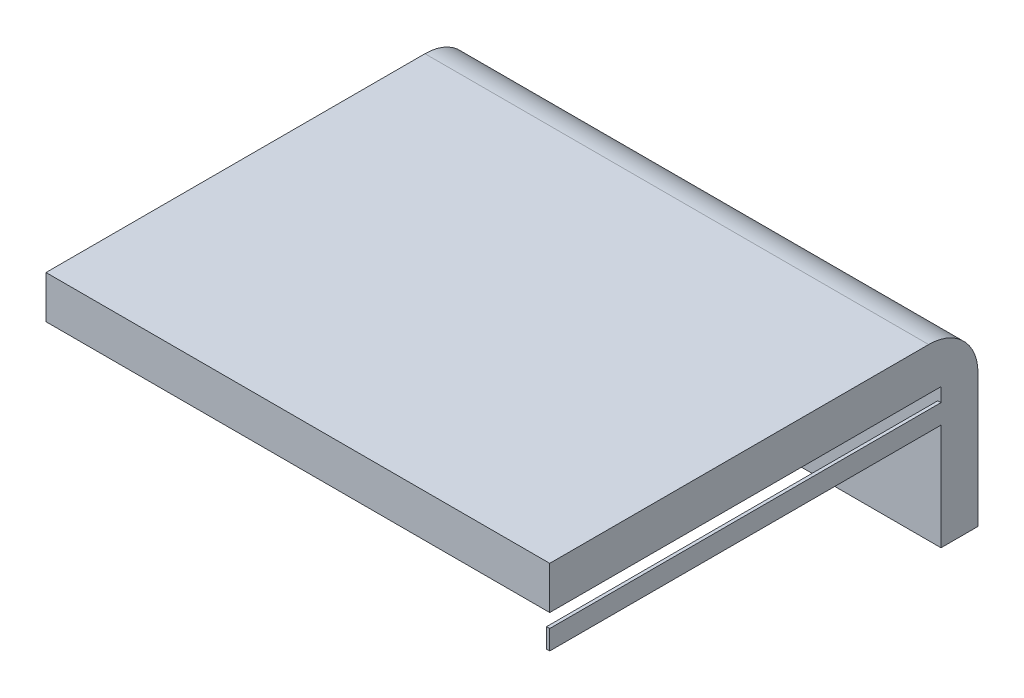
ISO-10303-21;
HEADER;
FILE_DESCRIPTION(('STEP AP214'),'2;1');
FILE_NAME('part.step','',(''),(''),'','','');
FILE_SCHEMA(('AUTOMOTIVE_DESIGN { 1 0 10303 214 1 1 1 1 }'));
ENDSEC;
DATA;
#1=APPLICATION_CONTEXT('core data for automotive mechanical design processes');
#2=APPLICATION_PROTOCOL_DEFINITION('international standard','automotive_design',2000,#1);
#3=PRODUCT_CONTEXT('',#1,'mechanical');
#4=PRODUCT('Part','Part','',(#3));
#5=PRODUCT_RELATED_PRODUCT_CATEGORY('part','',(#4));
#6=PRODUCT_DEFINITION_FORMATION('','',#4);
#7=PRODUCT_DEFINITION_CONTEXT('part definition',#1,'design');
#8=PRODUCT_DEFINITION('design','',#6,#7);
#9=PRODUCT_DEFINITION_SHAPE('','',#8);
#10=(LENGTH_UNIT() NAMED_UNIT(*) SI_UNIT(.MILLI.,.METRE.));
#11=(NAMED_UNIT(*) PLANE_ANGLE_UNIT() SI_UNIT($,.RADIAN.));
#12=(NAMED_UNIT(*) SI_UNIT($,.STERADIAN.) SOLID_ANGLE_UNIT());
#13=UNCERTAINTY_MEASURE_WITH_UNIT(LENGTH_MEASURE(1.E-05),#10,'distance_accuracy_value','');
#14=(GEOMETRIC_REPRESENTATION_CONTEXT(3) GLOBAL_UNCERTAINTY_ASSIGNED_CONTEXT((#13)) GLOBAL_UNIT_ASSIGNED_CONTEXT((#10,
#11,#12)) REPRESENTATION_CONTEXT('',''));
#15=CARTESIAN_POINT('',(0.,0.,0.));
#16=DIRECTION('',(0.,0.,1.));
#17=DIRECTION('',(1.,0.,0.));
#18=AXIS2_PLACEMENT_3D('',#15,#16,#17);
#19=CARTESIAN_POINT('',(374.479166666667,-68.9,-98.0208333333333));
#20=DIRECTION('',(0.,0.,-1.));
#21=DIRECTION('',(-1.,0.,0.));
#22=AXIS2_PLACEMENT_3D('',#19,#20,#21);
#23=PLANE('',#22);
#24=DIRECTION('',(1.,0.,0.));
#25=VECTOR('',#24,1.);
#26=CARTESIAN_POINT('',(373.179166666667,-12.9,-98.0208333333333));
#27=LINE('',#26,#25);
#28=CARTESIAN_POINT('',(373.179166666667,-12.9,-98.0208333333333));
#29=VERTEX_POINT('',#28);
#30=CARTESIAN_POINT('',(374.479166666667,-12.9,-98.0208333333333));
#31=VERTEX_POINT('',#30);
#32=EDGE_CURVE('E162',#29,#31,#27,.T.);
#33=ORIENTED_EDGE('',*,*,#32,.T.);
#34=DIRECTION('',(0.,1.,0.));
#35=VECTOR('',#34,1.);
#36=CARTESIAN_POINT('',(374.479166666667,-68.9,-98.0208333333333));
#37=LINE('',#36,#35);
#38=CARTESIAN_POINT('',(374.479166666667,-7.3,-98.0208333333333));
#39=VERTEX_POINT('',#38);
#40=EDGE_CURVE('E199',#31,#39,#37,.T.);
#41=ORIENTED_EDGE('',*,*,#40,.T.);
#42=DIRECTION('',(1.,0.,0.));
#43=VECTOR('',#42,1.);
#44=CARTESIAN_POINT('',(170.179166666667,-7.3,-98.0208333333333));
#45=LINE('',#44,#43);
#46=CARTESIAN_POINT('',(170.179166666667,-7.3,-98.0208333333333));
#47=VERTEX_POINT('',#46);
#48=EDGE_CURVE('E161',#47,#39,#45,.T.);
#49=ORIENTED_EDGE('',*,*,#48,.F.);
#50=DIRECTION('',(0.,1.,0.));
#51=VECTOR('',#50,1.);
#52=CARTESIAN_POINT('',(170.179166666667,-68.9,-98.0208333333333));
#53=LINE('',#52,#51);
#54=CARTESIAN_POINT('',(170.179166666667,-63.9,-98.0208333333333));
#55=VERTEX_POINT('',#54);
#56=EDGE_CURVE('E195',#55,#47,#53,.T.);
#57=ORIENTED_EDGE('',*,*,#56,.F.);
#58=DIRECTION('',(-1.,0.,0.));
#59=VECTOR('',#58,1.);
#60=CARTESIAN_POINT('',(170.179166666667,-63.9,-98.0208333333333));
#61=LINE('',#60,#59);
#62=CARTESIAN_POINT('',(374.479166666667,-63.9,-98.0208333333333));
#63=VERTEX_POINT('',#62);
#64=EDGE_CURVE('E181',#63,#55,#61,.T.);
#65=ORIENTED_EDGE('',*,*,#64,.F.);
#66=CARTESIAN_POINT('',(374.479166666667,-20.8,-98.0208333333333));
#67=VERTEX_POINT('',#66);
#68=EDGE_CURVE('E200',#63,#67,#37,.T.);
#69=ORIENTED_EDGE('',*,*,#68,.T.);
#70=DIRECTION('',(1.,0.,0.));
#71=VECTOR('',#70,1.);
#72=CARTESIAN_POINT('',(373.179166666667,-20.8,-98.0208333333333));
#73=LINE('',#72,#71);
#74=CARTESIAN_POINT('',(373.179166666667,-20.8,-98.0208333333333));
#75=VERTEX_POINT('',#74);
#76=EDGE_CURVE('E55',#75,#67,#73,.T.);
#77=ORIENTED_EDGE('',*,*,#76,.F.);
#78=DIRECTION('',(0.,-1.,0.));
#79=VECTOR('',#78,1.);
#80=CARTESIAN_POINT('',(373.179166666667,0.,-98.0208333333333));
#81=LINE('',#80,#79);
#82=EDGE_CURVE('E59',#29,#75,#81,.T.);
#83=ORIENTED_EDGE('',*,*,#82,.F.);
#84=EDGE_LOOP('',(#33,#41,#49,#57,#65,#69,#77,#83));
#85=FACE_BOUND('',#84,.T.);
#86=ADVANCED_FACE('F39',(#85),#23,.F.);
#87=CARTESIAN_POINT('',(0.,-10.,-93.0208333333333));
#88=DIRECTION('',(1.,0.,0.));
#89=DIRECTION('',(0.,0.,-1.));
#90=AXIS2_PLACEMENT_3D('',#87,#88,#89);
#91=CYLINDRICAL_SURFACE('',#90,20.);
#92=DIRECTION('',(-1.,0.,0.));
#93=VECTOR('',#92,1.);
#94=CARTESIAN_POINT('',(0.,10.,-93.0208333333333));
#95=LINE('',#94,#93);
#96=CARTESIAN_POINT('',(374.479166666667,10.,-93.0208333333334));
#97=VERTEX_POINT('',#96);
#98=CARTESIAN_POINT('',(170.179166666667,10.,-93.0208333333334));
#99=VERTEX_POINT('',#98);
#100=EDGE_CURVE('E225',#97,#99,#95,.T.);
#101=ORIENTED_EDGE('',*,*,#100,.F.);
#102=CARTESIAN_POINT('',(374.479166666667,-10.,-93.0208333333333));
#103=DIRECTION('',(-1.,0.,0.));
#104=DIRECTION('',(0.,0.,1.));
#105=AXIS2_PLACEMENT_3D('',#102,#103,#104);
#106=CIRCLE('',#105,20.);
#107=CARTESIAN_POINT('',(374.479166666667,-10.,-113.020833333333));
#108=VERTEX_POINT('',#107);
#109=EDGE_CURVE('E48',#108,#97,#106,.F.);
#110=ORIENTED_EDGE('',*,*,#109,.F.);
#111=DIRECTION('',(-1.,0.,0.));
#112=VECTOR('',#111,1.);
#113=CARTESIAN_POINT('',(0.,-10.,-113.020833333333));
#114=LINE('',#113,#112);
#115=CARTESIAN_POINT('',(170.179166666667,-10.,-113.020833333333));
#116=VERTEX_POINT('',#115);
#117=EDGE_CURVE('E229',#116,#108,#114,.F.);
#118=ORIENTED_EDGE('',*,*,#117,.F.);
#119=CARTESIAN_POINT('',(170.179166666667,-10.,-93.0208333333333));
#120=DIRECTION('',(1.,0.,0.));
#121=DIRECTION('',(0.,0.,-1.));
#122=AXIS2_PLACEMENT_3D('',#119,#120,#121);
#123=CIRCLE('',#122,20.);
#124=EDGE_CURVE('E11',#99,#116,#123,.F.);
#125=ORIENTED_EDGE('',*,*,#124,.F.);
#126=EDGE_LOOP('',(#101,#110,#118,#125));
#127=FACE_BOUND('',#126,.T.);
#128=ADVANCED_FACE('F41',(#127),#91,.T.);
#129=CARTESIAN_POINT('',(170.179166666667,10.,-113.020833333333));
#130=DIRECTION('',(1.,0.,0.));
#131=DIRECTION('',(0.,0.,-1.));
#132=AXIS2_PLACEMENT_3D('',#129,#130,#131);
#133=PLANE('',#132);
#134=DIRECTION('',(0.,0.,1.));
#135=VECTOR('',#134,1.);
#136=CARTESIAN_POINT('',(170.179166666667,10.,-113.020833333333));
#137=LINE('',#136,#135);
#138=CARTESIAN_POINT('',(170.179166666667,10.,60.6791666666667));
#139=VERTEX_POINT('',#138);
#140=EDGE_CURVE('E203',#99,#139,#137,.T.);
#141=ORIENTED_EDGE('',*,*,#140,.F.);
#142=ORIENTED_EDGE('',*,*,#124,.T.);
#143=DIRECTION('',(0.,-1.,0.));
#144=VECTOR('',#143,1.);
#145=CARTESIAN_POINT('',(170.179166666667,10.,-113.020833333333));
#146=LINE('',#145,#144);
#147=CARTESIAN_POINT('',(170.179166666667,-63.9,-113.020833333333));
#148=VERTEX_POINT('',#147);
#149=EDGE_CURVE('E213',#116,#148,#146,.T.);
#150=ORIENTED_EDGE('',*,*,#149,.T.);
#151=DIRECTION('',(0.,0.,1.));
#152=VECTOR('',#151,1.);
#153=CARTESIAN_POINT('',(170.179166666667,-63.9,-124.020833333333));
#154=LINE('',#153,#152);
#155=EDGE_CURVE('E185',#148,#55,#154,.T.);
#156=ORIENTED_EDGE('',*,*,#155,.T.);
#157=ORIENTED_EDGE('',*,*,#56,.T.);
#158=DIRECTION('',(0.,0.,-1.));
#159=VECTOR('',#158,1.);
#160=CARTESIAN_POINT('',(170.179166666667,-7.3,60.6791666666667));
#161=LINE('',#160,#159);
#162=CARTESIAN_POINT('',(170.179166666667,-7.3,60.6791666666667));
#163=VERTEX_POINT('',#162);
#164=EDGE_CURVE('E174',#163,#47,#161,.T.);
#165=ORIENTED_EDGE('',*,*,#164,.F.);
#166=DIRECTION('',(0.,-1.,0.));
#167=VECTOR('',#166,1.);
#168=CARTESIAN_POINT('',(170.179166666667,10.,60.6791666666667));
#169=LINE('',#168,#167);
#170=EDGE_CURVE('E222',#139,#163,#169,.T.);
#171=ORIENTED_EDGE('',*,*,#170,.F.);
#172=EDGE_LOOP('',(#141,#142,#150,#156,#157,#165,#171));
#173=FACE_BOUND('',#172,.T.);
#174=ADVANCED_FACE('F259',(#173),#133,.F.);
#175=CARTESIAN_POINT('',(170.179166666667,10.,60.6791666666667));
#176=DIRECTION('',(0.,0.,-1.));
#177=DIRECTION('',(-1.,0.,0.));
#178=AXIS2_PLACEMENT_3D('',#175,#176,#177);
#179=PLANE('',#178);
#180=ORIENTED_EDGE('',*,*,#170,.T.);
#181=DIRECTION('',(-1.,0.,0.));
#182=VECTOR('',#181,1.);
#183=CARTESIAN_POINT('',(374.479166666667,-7.3,60.6791666666667));
#184=LINE('',#183,#182);
#185=CARTESIAN_POINT('',(374.479166666667,-7.3,60.6791666666667));
#186=VERTEX_POINT('',#185);
#187=EDGE_CURVE('E177',#186,#163,#184,.T.);
#188=ORIENTED_EDGE('',*,*,#187,.F.);
#189=DIRECTION('',(0.,-1.,0.));
#190=VECTOR('',#189,1.);
#191=CARTESIAN_POINT('',(374.479166666667,10.,60.6791666666667));
#192=LINE('',#191,#190);
#193=CARTESIAN_POINT('',(374.479166666667,10.,60.6791666666667));
#194=VERTEX_POINT('',#193);
#195=EDGE_CURVE('E219',#194,#186,#192,.T.);
#196=ORIENTED_EDGE('',*,*,#195,.F.);
#197=DIRECTION('',(1.,0.,0.));
#198=VECTOR('',#197,1.);
#199=CARTESIAN_POINT('',(170.179166666667,10.,60.6791666666667));
#200=LINE('',#199,#198);
#201=EDGE_CURVE('E206',#139,#194,#200,.T.);
#202=ORIENTED_EDGE('',*,*,#201,.F.);
#203=EDGE_LOOP('',(#180,#188,#196,#202));
#204=FACE_BOUND('',#203,.T.);
#205=ADVANCED_FACE('F249',(#204),#179,.F.);
#206=CARTESIAN_POINT('',(374.479166666667,10.,-113.020833333333));
#207=DIRECTION('',(-1.,0.,0.));
#208=DIRECTION('',(0.,0.,1.));
#209=AXIS2_PLACEMENT_3D('',#206,#207,#208);
#210=PLANE('',#209);
#211=DIRECTION('',(0.,-1.,0.));
#212=VECTOR('',#211,1.);
#213=CARTESIAN_POINT('',(374.479166666667,10.,-113.020833333333));
#214=LINE('',#213,#212);
#215=CARTESIAN_POINT('',(374.479166666667,-63.9,-113.020833333333));
#216=VERTEX_POINT('',#215);
#217=EDGE_CURVE('E216',#108,#216,#214,.T.);
#218=ORIENTED_EDGE('',*,*,#217,.F.);
#219=ORIENTED_EDGE('',*,*,#109,.T.);
#220=DIRECTION('',(0.,0.,-1.));
#221=VECTOR('',#220,1.);
#222=CARTESIAN_POINT('',(374.479166666667,10.,-113.020833333333));
#223=LINE('',#222,#221);
#224=EDGE_CURVE('E209',#194,#97,#223,.T.);
#225=ORIENTED_EDGE('',*,*,#224,.F.);
#226=ORIENTED_EDGE('',*,*,#195,.T.);
#227=DIRECTION('',(0.,0.,-1.));
#228=VECTOR('',#227,1.);
#229=CARTESIAN_POINT('',(374.479166666667,-7.3,60.6791666666667));
#230=LINE('',#229,#228);
#231=EDGE_CURVE('E170',#186,#39,#230,.T.);
#232=ORIENTED_EDGE('',*,*,#231,.T.);
#233=ORIENTED_EDGE('',*,*,#40,.F.);
#234=DIRECTION('',(0.,0.,-1.));
#235=VECTOR('',#234,1.);
#236=CARTESIAN_POINT('',(374.479166666667,-12.9,-1.23562285873821E-13));
#237=LINE('',#236,#235);
#238=CARTESIAN_POINT('',(374.479166666667,-12.9,60.6791666666667));
#239=VERTEX_POINT('',#238);
#240=EDGE_CURVE('E144',#239,#31,#237,.T.);
#241=ORIENTED_EDGE('',*,*,#240,.F.);
#242=DIRECTION('',(0.,-1.,0.));
#243=VECTOR('',#242,1.);
#244=CARTESIAN_POINT('',(374.479166666667,0.,60.6791666666667));
#245=LINE('',#244,#243);
#246=CARTESIAN_POINT('',(374.479166666667,-20.8,60.6791666666667));
#247=VERTEX_POINT('',#246);
#248=EDGE_CURVE('E154',#239,#247,#245,.T.);
#249=ORIENTED_EDGE('',*,*,#248,.T.);
#250=DIRECTION('',(0.,0.,-1.));
#251=VECTOR('',#250,1.);
#252=CARTESIAN_POINT('',(374.479166666667,-20.8,-1.23562285873821E-13));
#253=LINE('',#252,#251);
#254=EDGE_CURVE('E126',#247,#67,#253,.T.);
#255=ORIENTED_EDGE('',*,*,#254,.T.);
#256=ORIENTED_EDGE('',*,*,#68,.F.);
#257=DIRECTION('',(0.,0.,1.));
#258=VECTOR('',#257,1.);
#259=CARTESIAN_POINT('',(374.479166666667,-63.9,-124.020833333333));
#260=LINE('',#259,#258);
#261=EDGE_CURVE('E184',#216,#63,#260,.T.);
#262=ORIENTED_EDGE('',*,*,#261,.F.);
#263=EDGE_LOOP('',(#218,#219,#225,#226,#232,#233,#241,#249,#255,#256,#262));
#264=FACE_BOUND('',#263,.T.);
#265=ADVANCED_FACE('F237',(#264),#210,.F.);
#266=CARTESIAN_POINT('',(170.179166666667,10.,-113.020833333333));
#267=DIRECTION('',(0.,0.,1.));
#268=DIRECTION('',(1.,0.,0.));
#269=AXIS2_PLACEMENT_3D('',#266,#267,#268);
#270=PLANE('',#269);
#271=ORIENTED_EDGE('',*,*,#149,.F.);
#272=ORIENTED_EDGE('',*,*,#117,.T.);
#273=ORIENTED_EDGE('',*,*,#217,.T.);
#274=DIRECTION('',(-1.,0.,0.));
#275=VECTOR('',#274,1.);
#276=CARTESIAN_POINT('',(170.179166666667,-63.9,-113.020833333333));
#277=LINE('',#276,#275);
#278=EDGE_CURVE('E189',#216,#148,#277,.T.);
#279=ORIENTED_EDGE('',*,*,#278,.T.);
#280=EDGE_LOOP('',(#271,#272,#273,#279));
#281=FACE_BOUND('',#280,.T.);
#282=ADVANCED_FACE('F266',(#281),#270,.F.);
#283=CARTESIAN_POINT('',(0.,10.,0.));
#284=DIRECTION('',(0.,1.,0.));
#285=DIRECTION('',(0.,0.,1.));
#286=AXIS2_PLACEMENT_3D('',#283,#284,#285);
#287=PLANE('',#286);
#288=ORIENTED_EDGE('',*,*,#224,.T.);
#289=ORIENTED_EDGE('',*,*,#100,.T.);
#290=ORIENTED_EDGE('',*,*,#140,.T.);
#291=ORIENTED_EDGE('',*,*,#201,.T.);
#292=EDGE_LOOP('',(#288,#289,#290,#291));
#293=FACE_BOUND('',#292,.T.);
#294=ADVANCED_FACE('F243',(#293),#287,.T.);
#295=CARTESIAN_POINT('',(170.179166666667,-63.9,-124.020833333333));
#296=DIRECTION('',(0.,1.,0.));
#297=DIRECTION('',(0.,0.,1.));
#298=AXIS2_PLACEMENT_3D('',#295,#296,#297);
#299=PLANE('',#298);
#300=ORIENTED_EDGE('',*,*,#261,.T.);
#301=ORIENTED_EDGE('',*,*,#64,.T.);
#302=ORIENTED_EDGE('',*,*,#155,.F.);
#303=ORIENTED_EDGE('',*,*,#278,.F.);
#304=EDGE_LOOP('',(#300,#301,#302,#303));
#305=FACE_BOUND('',#304,.T.);
#306=ADVANCED_FACE('F264',(#305),#299,.F.);
#307=CARTESIAN_POINT('',(0.,-7.3,0.));
#308=DIRECTION('',(0.,1.,0.));
#309=DIRECTION('',(0.,0.,1.));
#310=AXIS2_PLACEMENT_3D('',#307,#308,#309);
#311=PLANE('',#310);
#312=ORIENTED_EDGE('',*,*,#231,.F.);
#313=ORIENTED_EDGE('',*,*,#187,.T.);
#314=ORIENTED_EDGE('',*,*,#164,.T.);
#315=ORIENTED_EDGE('',*,*,#48,.T.);
#316=EDGE_LOOP('',(#312,#313,#314,#315));
#317=FACE_BOUND('',#316,.T.);
#318=ADVANCED_FACE('F254',(#317),#311,.F.);
#319=CARTESIAN_POINT('',(373.179166666667,0.,60.6791666666667));
#320=DIRECTION('',(0.,0.,1.));
#321=DIRECTION('',(1.,0.,0.));
#322=AXIS2_PLACEMENT_3D('',#319,#320,#321);
#323=PLANE('',#322);
#324=ORIENTED_EDGE('',*,*,#248,.F.);
#325=DIRECTION('',(1.,0.,0.));
#326=VECTOR('',#325,1.);
#327=CARTESIAN_POINT('',(373.179166666667,-12.9,60.6791666666667));
#328=LINE('',#327,#326);
#329=CARTESIAN_POINT('',(373.179166666667,-12.9,60.6791666666667));
#330=VERTEX_POINT('',#329);
#331=EDGE_CURVE('E141',#330,#239,#328,.T.);
#332=ORIENTED_EDGE('',*,*,#331,.F.);
#333=DIRECTION('',(0.,-1.,0.));
#334=VECTOR('',#333,1.);
#335=CARTESIAN_POINT('',(373.179166666667,0.,60.6791666666667));
#336=LINE('',#335,#334);
#337=CARTESIAN_POINT('',(373.179166666667,-20.8,60.6791666666667));
#338=VERTEX_POINT('',#337);
#339=EDGE_CURVE('E137',#330,#338,#336,.T.);
#340=ORIENTED_EDGE('',*,*,#339,.T.);
#341=DIRECTION('',(1.,0.,0.));
#342=VECTOR('',#341,1.);
#343=CARTESIAN_POINT('',(373.179166666667,-20.8,60.6791666666667));
#344=LINE('',#343,#342);
#345=EDGE_CURVE('E121',#338,#247,#344,.T.);
#346=ORIENTED_EDGE('',*,*,#345,.T.);
#347=EDGE_LOOP('',(#324,#332,#340,#346));
#348=FACE_BOUND('',#347,.T.);
#349=ADVANCED_FACE('F140',(#348),#323,.T.);
#350=CARTESIAN_POINT('',(373.179166666667,-12.9,-1.23146831086252E-13));
#351=DIRECTION('',(0.,-1.,0.));
#352=DIRECTION('',(0.,0.,-1.));
#353=AXIS2_PLACEMENT_3D('',#350,#351,#352);
#354=PLANE('',#353);
#355=ORIENTED_EDGE('',*,*,#240,.T.);
#356=ORIENTED_EDGE('',*,*,#32,.F.);
#357=DIRECTION('',(0.,0.,-1.));
#358=VECTOR('',#357,1.);
#359=CARTESIAN_POINT('',(373.179166666667,-12.9,-1.23146831086252E-13));
#360=LINE('',#359,#358);
#361=EDGE_CURVE('E132',#330,#29,#360,.T.);
#362=ORIENTED_EDGE('',*,*,#361,.F.);
#363=ORIENTED_EDGE('',*,*,#331,.T.);
#364=EDGE_LOOP('',(#355,#356,#362,#363));
#365=FACE_BOUND('',#364,.T.);
#366=ADVANCED_FACE('F287',(#365),#354,.F.);
#367=CARTESIAN_POINT('',(373.179166666667,-20.8,-1.23146831086252E-13));
#368=DIRECTION('',(0.,-1.,0.));
#369=DIRECTION('',(0.,0.,-1.));
#370=AXIS2_PLACEMENT_3D('',#367,#368,#369);
#371=PLANE('',#370);
#372=ORIENTED_EDGE('',*,*,#254,.F.);
#373=ORIENTED_EDGE('',*,*,#345,.F.);
#374=DIRECTION('',(0.,0.,-1.));
#375=VECTOR('',#374,1.);
#376=CARTESIAN_POINT('',(373.179166666667,-20.8,-1.23146831086252E-13));
#377=LINE('',#376,#375);
#378=EDGE_CURVE('E124',#338,#75,#377,.T.);
#379=ORIENTED_EDGE('',*,*,#378,.T.);
#380=ORIENTED_EDGE('',*,*,#76,.T.);
#381=EDGE_LOOP('',(#372,#373,#379,#380));
#382=FACE_BOUND('',#381,.T.);
#383=ADVANCED_FACE('F123',(#382),#371,.T.);
#384=CARTESIAN_POINT('',(373.179166666667,0.,-1.23146831086252E-13));
#385=DIRECTION('',(1.,0.,0.));
#386=DIRECTION('',(0.,0.,-1.));
#387=AXIS2_PLACEMENT_3D('',#384,#385,#386);
#388=PLANE('',#387);
#389=ORIENTED_EDGE('',*,*,#339,.F.);
#390=ORIENTED_EDGE('',*,*,#361,.T.);
#391=ORIENTED_EDGE('',*,*,#82,.T.);
#392=ORIENTED_EDGE('',*,*,#378,.F.);
#393=EDGE_LOOP('',(#389,#390,#391,#392));
#394=FACE_BOUND('',#393,.T.);
#395=ADVANCED_FACE('F136',(#394),#388,.F.);
#396=CLOSED_SHELL('',(#86,#128,#174,#205,#265,#282,#294,#306,#318,#349,#366,#383,#395));
#397=MANIFOLD_SOLID_BREP('B2',#396);
#398=ADVANCED_BREP_SHAPE_REPRESENTATION('',(#18,#397),#14);
#399=SHAPE_DEFINITION_REPRESENTATION(#9,#398);
ENDSEC;
END-ISO-10303-21;
